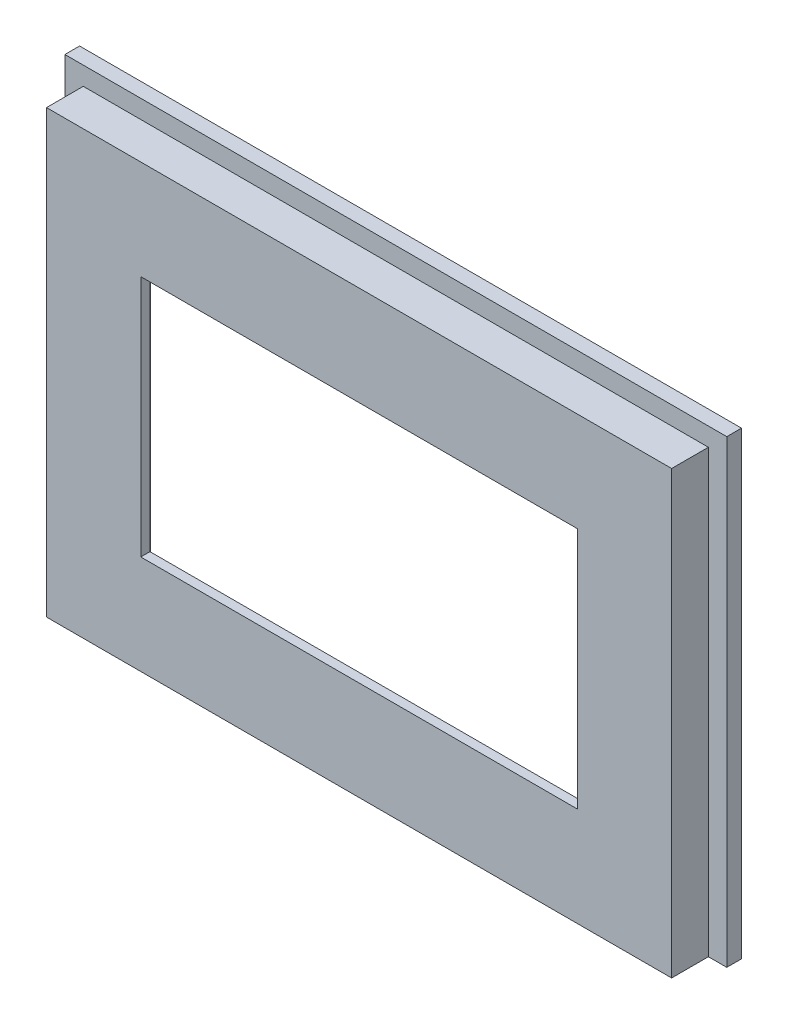
ISO-10303-21;
HEADER;
FILE_DESCRIPTION(('STEP AP214'),'2;1');
FILE_NAME('part.step','',(''),(''),'','','');
FILE_SCHEMA(('AUTOMOTIVE_DESIGN { 1 0 10303 214 1 1 1 1 }'));
ENDSEC;
DATA;
#1=APPLICATION_CONTEXT('core data for automotive mechanical design processes');
#2=APPLICATION_PROTOCOL_DEFINITION('international standard','automotive_design',2000,#1);
#3=PRODUCT_CONTEXT('',#1,'mechanical');
#4=PRODUCT('Part','Part','',(#3));
#5=PRODUCT_RELATED_PRODUCT_CATEGORY('part','',(#4));
#6=PRODUCT_DEFINITION_FORMATION('','',#4);
#7=PRODUCT_DEFINITION_CONTEXT('part definition',#1,'design');
#8=PRODUCT_DEFINITION('design','',#6,#7);
#9=PRODUCT_DEFINITION_SHAPE('','',#8);
#10=(LENGTH_UNIT() NAMED_UNIT(*) SI_UNIT(.MILLI.,.METRE.));
#11=(NAMED_UNIT(*) PLANE_ANGLE_UNIT() SI_UNIT($,.RADIAN.));
#12=(NAMED_UNIT(*) SI_UNIT($,.STERADIAN.) SOLID_ANGLE_UNIT());
#13=UNCERTAINTY_MEASURE_WITH_UNIT(LENGTH_MEASURE(1.E-05),#10,'distance_accuracy_value','');
#14=(GEOMETRIC_REPRESENTATION_CONTEXT(3) GLOBAL_UNCERTAINTY_ASSIGNED_CONTEXT((#13)) GLOBAL_UNIT_ASSIGNED_CONTEXT((#10,
#11,#12)) REPRESENTATION_CONTEXT('',''));
#15=CARTESIAN_POINT('',(0.,0.,0.));
#16=DIRECTION('',(0.,0.,1.));
#17=DIRECTION('',(1.,0.,0.));
#18=AXIS2_PLACEMENT_3D('',#15,#16,#17);
#19=CARTESIAN_POINT('',(0.,0.,0.));
#20=DIRECTION('',(0.,0.,1.));
#21=DIRECTION('',(1.,0.,0.));
#22=AXIS2_PLACEMENT_3D('',#19,#20,#21);
#23=PLANE('',#22);
#24=DIRECTION('',(0.,1.,0.));
#25=VECTOR('',#24,1.);
#26=CARTESIAN_POINT('',(-1.,0.,0.));
#27=LINE('',#26,#25);
#28=CARTESIAN_POINT('',(-1.,0.,0.));
#29=VERTEX_POINT('',#28);
#30=CARTESIAN_POINT('',(-1.,23.,0.));
#31=VERTEX_POINT('',#30);
#32=EDGE_CURVE('E192',#29,#31,#27,.T.);
#33=ORIENTED_EDGE('',*,*,#32,.F.);
#34=DIRECTION('',(1.,0.,0.));
#35=VECTOR('',#34,1.);
#36=CARTESIAN_POINT('',(0.,0.,0.));
#37=LINE('',#36,#35);
#38=CARTESIAN_POINT('',(-3.652,0.,0.));
#39=VERTEX_POINT('',#38);
#40=EDGE_CURVE('E291',#39,#29,#37,.T.);
#41=ORIENTED_EDGE('',*,*,#40,.F.);
#42=DIRECTION('',(0.,-1.,0.));
#43=VECTOR('',#42,1.);
#44=CARTESIAN_POINT('',(-3.652,19.748,0.));
#45=LINE('',#44,#43);
#46=CARTESIAN_POINT('',(-3.652,19.748,0.));
#47=VERTEX_POINT('',#46);
#48=EDGE_CURVE('E193',#47,#39,#45,.T.);
#49=ORIENTED_EDGE('',*,*,#48,.F.);
#50=DIRECTION('',(1.,0.,0.));
#51=VECTOR('',#50,1.);
#52=CARTESIAN_POINT('',(-3.652,19.748,0.));
#53=LINE('',#52,#51);
#54=CARTESIAN_POINT('',(-30.352,19.748,0.));
#55=VERTEX_POINT('',#54);
#56=EDGE_CURVE('E404',#55,#47,#53,.T.);
#57=ORIENTED_EDGE('',*,*,#56,.F.);
#58=DIRECTION('',(0.,1.,0.));
#59=VECTOR('',#58,1.);
#60=CARTESIAN_POINT('',(-30.352,19.748,0.));
#61=LINE('',#60,#59);
#62=CARTESIAN_POINT('',(-30.352,0.,0.));
#63=VERTEX_POINT('',#62);
#64=EDGE_CURVE('E195',#63,#55,#61,.T.);
#65=ORIENTED_EDGE('',*,*,#64,.F.);
#66=CARTESIAN_POINT('',(-33.,0.,0.));
#67=VERTEX_POINT('',#66);
#68=EDGE_CURVE('E55',#67,#63,#37,.T.);
#69=ORIENTED_EDGE('',*,*,#68,.F.);
#70=DIRECTION('',(0.,-1.,0.));
#71=VECTOR('',#70,1.);
#72=CARTESIAN_POINT('',(-33.,23.,0.));
#73=LINE('',#72,#71);
#74=CARTESIAN_POINT('',(-33.,23.,0.));
#75=VERTEX_POINT('',#74);
#76=EDGE_CURVE('E232',#75,#67,#73,.T.);
#77=ORIENTED_EDGE('',*,*,#76,.F.);
#78=DIRECTION('',(-1.,0.,0.));
#79=VECTOR('',#78,1.);
#80=CARTESIAN_POINT('',(-1.,23.,0.));
#81=LINE('',#80,#79);
#82=EDGE_CURVE('E49',#31,#75,#81,.T.);
#83=ORIENTED_EDGE('',*,*,#82,.F.);
#84=EDGE_LOOP('',(#33,#41,#49,#57,#65,#69,#77,#83));
#85=FACE_BOUND('',#84,.T.);
#86=ADVANCED_FACE('F32',(#85),#23,.F.);
#87=CARTESIAN_POINT('',(-28.874,18.6,2.));
#88=DIRECTION('',(1.,0.,0.));
#89=DIRECTION('',(0.,0.,-1.));
#90=AXIS2_PLACEMENT_3D('',#87,#88,#89);
#91=PLANE('',#90);
#92=DIRECTION('',(0.,0.,-1.));
#93=VECTOR('',#92,1.);
#94=CARTESIAN_POINT('',(-28.874,5.396,2.));
#95=LINE('',#94,#93);
#96=CARTESIAN_POINT('',(-28.874,5.396,2.));
#97=VERTEX_POINT('',#96);
#98=CARTESIAN_POINT('',(-28.874,5.396,1.5));
#99=VERTEX_POINT('',#98);
#100=EDGE_CURVE('E265',#97,#99,#95,.T.);
#101=ORIENTED_EDGE('',*,*,#100,.T.);
#102=DIRECTION('',(0.,1.,0.));
#103=VECTOR('',#102,1.);
#104=CARTESIAN_POINT('',(-28.874,18.6,1.5));
#105=LINE('',#104,#103);
#106=CARTESIAN_POINT('',(-28.874,18.6,1.5));
#107=VERTEX_POINT('',#106);
#108=EDGE_CURVE('E389',#99,#107,#105,.T.);
#109=ORIENTED_EDGE('',*,*,#108,.T.);
#110=DIRECTION('',(0.,0.,-1.));
#111=VECTOR('',#110,1.);
#112=CARTESIAN_POINT('',(-28.874,18.6,2.));
#113=LINE('',#112,#111);
#114=CARTESIAN_POINT('',(-28.874,18.6,2.));
#115=VERTEX_POINT('',#114);
#116=EDGE_CURVE('E375',#115,#107,#113,.T.);
#117=ORIENTED_EDGE('',*,*,#116,.F.);
#118=DIRECTION('',(0.,-1.,0.));
#119=VECTOR('',#118,1.);
#120=CARTESIAN_POINT('',(-28.874,18.6,2.));
#121=LINE('',#120,#119);
#122=EDGE_CURVE('E385',#115,#97,#121,.T.);
#123=ORIENTED_EDGE('',*,*,#122,.T.);
#124=EDGE_LOOP('',(#101,#109,#117,#123));
#125=FACE_BOUND('',#124,.T.);
#126=ADVANCED_FACE('F342',(#125),#91,.T.);
#127=CARTESIAN_POINT('',(-28.874,5.396,2.));
#128=DIRECTION('',(0.,1.,0.));
#129=DIRECTION('',(0.,0.,1.));
#130=AXIS2_PLACEMENT_3D('',#127,#128,#129);
#131=PLANE('',#130);
#132=DIRECTION('',(0.,0.,-1.));
#133=VECTOR('',#132,1.);
#134=CARTESIAN_POINT('',(-5.13,5.396,2.));
#135=LINE('',#134,#133);
#136=CARTESIAN_POINT('',(-5.13,5.396,2.));
#137=VERTEX_POINT('',#136);
#138=CARTESIAN_POINT('',(-5.13,5.396,1.5));
#139=VERTEX_POINT('',#138);
#140=EDGE_CURVE('E270',#137,#139,#135,.T.);
#141=ORIENTED_EDGE('',*,*,#140,.T.);
#142=DIRECTION('',(-1.,0.,0.));
#143=VECTOR('',#142,1.);
#144=CARTESIAN_POINT('',(-28.874,5.396,1.5));
#145=LINE('',#144,#143);
#146=EDGE_CURVE('E392',#139,#99,#145,.T.);
#147=ORIENTED_EDGE('',*,*,#146,.T.);
#148=ORIENTED_EDGE('',*,*,#100,.F.);
#149=DIRECTION('',(1.,0.,0.));
#150=VECTOR('',#149,1.);
#151=CARTESIAN_POINT('',(-28.874,5.396,2.));
#152=LINE('',#151,#150);
#153=EDGE_CURVE('E383',#97,#137,#152,.T.);
#154=ORIENTED_EDGE('',*,*,#153,.T.);
#155=EDGE_LOOP('',(#141,#147,#148,#154));
#156=FACE_BOUND('',#155,.T.);
#157=ADVANCED_FACE('F347',(#156),#131,.T.);
#158=CARTESIAN_POINT('',(-5.13,18.6,2.));
#159=DIRECTION('',(-1.,0.,0.));
#160=DIRECTION('',(0.,-1.,0.));
#161=AXIS2_PLACEMENT_3D('',#158,#159,#160);
#162=PLANE('',#161);
#163=DIRECTION('',(0.,0.,-1.));
#164=VECTOR('',#163,1.);
#165=CARTESIAN_POINT('',(-5.13,18.6,2.));
#166=LINE('',#165,#164);
#167=CARTESIAN_POINT('',(-5.13,18.6,2.));
#168=VERTEX_POINT('',#167);
#169=CARTESIAN_POINT('',(-5.13,18.6,1.5));
#170=VERTEX_POINT('',#169);
#171=EDGE_CURVE('E372',#168,#170,#166,.T.);
#172=ORIENTED_EDGE('',*,*,#171,.T.);
#173=DIRECTION('',(0.,-1.,0.));
#174=VECTOR('',#173,1.);
#175=CARTESIAN_POINT('',(-5.13,18.6,1.5));
#176=LINE('',#175,#174);
#177=EDGE_CURVE('E395',#170,#139,#176,.T.);
#178=ORIENTED_EDGE('',*,*,#177,.T.);
#179=ORIENTED_EDGE('',*,*,#140,.F.);
#180=DIRECTION('',(0.,1.,0.));
#181=VECTOR('',#180,1.);
#182=CARTESIAN_POINT('',(-5.13,18.6,2.));
#183=LINE('',#182,#181);
#184=EDGE_CURVE('E380',#137,#168,#183,.T.);
#185=ORIENTED_EDGE('',*,*,#184,.T.);
#186=EDGE_LOOP('',(#172,#178,#179,#185));
#187=FACE_BOUND('',#186,.T.);
#188=ADVANCED_FACE('F446',(#187),#162,.T.);
#189=CARTESIAN_POINT('',(-28.874,18.6,2.));
#190=DIRECTION('',(0.,-1.,0.));
#191=DIRECTION('',(0.,0.,-1.));
#192=AXIS2_PLACEMENT_3D('',#189,#190,#191);
#193=PLANE('',#192);
#194=ORIENTED_EDGE('',*,*,#116,.T.);
#195=DIRECTION('',(1.,0.,0.));
#196=VECTOR('',#195,1.);
#197=CARTESIAN_POINT('',(-28.874,18.6,1.5));
#198=LINE('',#197,#196);
#199=EDGE_CURVE('E296',#107,#170,#198,.T.);
#200=ORIENTED_EDGE('',*,*,#199,.T.);
#201=ORIENTED_EDGE('',*,*,#171,.F.);
#202=DIRECTION('',(-1.,0.,0.));
#203=VECTOR('',#202,1.);
#204=CARTESIAN_POINT('',(-28.874,18.6,2.));
#205=LINE('',#204,#203);
#206=EDGE_CURVE('E378',#168,#115,#205,.T.);
#207=ORIENTED_EDGE('',*,*,#206,.T.);
#208=EDGE_LOOP('',(#194,#200,#201,#207));
#209=FACE_BOUND('',#208,.T.);
#210=ADVANCED_FACE('F443',(#209),#193,.T.);
#211=CARTESIAN_POINT('',(0.,0.,2.));
#212=DIRECTION('',(0.,0.,1.));
#213=DIRECTION('',(1.,0.,0.));
#214=AXIS2_PLACEMENT_3D('',#211,#212,#213);
#215=PLANE('',#214);
#216=DIRECTION('',(0.,1.,0.));
#217=VECTOR('',#216,1.);
#218=CARTESIAN_POINT('',(0.,0.,2.));
#219=LINE('',#218,#217);
#220=CARTESIAN_POINT('',(0.,0.,2.));
#221=VERTEX_POINT('',#220);
#222=CARTESIAN_POINT('',(0.,24.,2.));
#223=VERTEX_POINT('',#222);
#224=EDGE_CURVE('E366',#221,#223,#219,.T.);
#225=ORIENTED_EDGE('',*,*,#224,.T.);
#226=DIRECTION('',(-1.,0.,0.));
#227=VECTOR('',#226,1.);
#228=CARTESIAN_POINT('',(0.,24.,2.));
#229=LINE('',#228,#227);
#230=CARTESIAN_POINT('',(-34.,24.,2.));
#231=VERTEX_POINT('',#230);
#232=EDGE_CURVE('E363',#223,#231,#229,.T.);
#233=ORIENTED_EDGE('',*,*,#232,.T.);
#234=DIRECTION('',(0.,-1.,0.));
#235=VECTOR('',#234,1.);
#236=CARTESIAN_POINT('',(-34.,0.,2.));
#237=LINE('',#236,#235);
#238=CARTESIAN_POINT('',(-34.,0.,2.));
#239=VERTEX_POINT('',#238);
#240=EDGE_CURVE('E312',#231,#239,#237,.T.);
#241=ORIENTED_EDGE('',*,*,#240,.T.);
#242=DIRECTION('',(1.,0.,0.));
#243=VECTOR('',#242,1.);
#244=CARTESIAN_POINT('',(0.,0.,2.));
#245=LINE('',#244,#243);
#246=EDGE_CURVE('E280',#239,#221,#245,.T.);
#247=ORIENTED_EDGE('',*,*,#246,.T.);
#248=EDGE_LOOP('',(#225,#233,#241,#247));
#249=FACE_BOUND('',#248,.T.);
#250=ORIENTED_EDGE('',*,*,#153,.F.);
#251=ORIENTED_EDGE('',*,*,#122,.F.);
#252=ORIENTED_EDGE('',*,*,#206,.F.);
#253=ORIENTED_EDGE('',*,*,#184,.F.);
#254=EDGE_LOOP('',(#250,#251,#252,#253));
#255=FACE_BOUND('',#254,.T.);
#256=ADVANCED_FACE('F352',(#249,#255),#215,.T.);
#257=CARTESIAN_POINT('',(0.,0.,2.));
#258=DIRECTION('',(-1.,0.,0.));
#259=DIRECTION('',(0.,-1.,0.));
#260=AXIS2_PLACEMENT_3D('',#257,#258,#259);
#261=PLANE('',#260);
#262=DIRECTION('',(0.,1.,0.));
#263=VECTOR('',#262,1.);
#264=CARTESIAN_POINT('',(0.,0.,0.));
#265=LINE('',#264,#263);
#266=CARTESIAN_POINT('',(0.,0.,0.));
#267=VERTEX_POINT('',#266);
#268=CARTESIAN_POINT('',(0.,24.,0.));
#269=VERTEX_POINT('',#268);
#270=EDGE_CURVE('E261',#267,#269,#265,.T.);
#271=ORIENTED_EDGE('',*,*,#270,.T.);
#272=DIRECTION('',(0.,0.,-1.));
#273=VECTOR('',#272,1.);
#274=CARTESIAN_POINT('',(0.,24.,2.));
#275=LINE('',#274,#273);
#276=EDGE_CURVE('E298',#223,#269,#275,.T.);
#277=ORIENTED_EDGE('',*,*,#276,.F.);
#278=ORIENTED_EDGE('',*,*,#224,.F.);
#279=DIRECTION('',(0.,0.,-1.));
#280=VECTOR('',#279,1.);
#281=CARTESIAN_POINT('',(0.,0.,2.));
#282=LINE('',#281,#280);
#283=EDGE_CURVE('E306',#221,#267,#282,.T.);
#284=ORIENTED_EDGE('',*,*,#283,.T.);
#285=EDGE_LOOP('',(#271,#277,#278,#284));
#286=FACE_BOUND('',#285,.T.);
#287=ADVANCED_FACE('F34',(#286),#261,.F.);
#288=CARTESIAN_POINT('',(0.,24.,2.));
#289=DIRECTION('',(0.,-1.,0.));
#290=DIRECTION('',(1.,0.,0.));
#291=AXIS2_PLACEMENT_3D('',#288,#289,#290);
#292=PLANE('',#291);
#293=DIRECTION('',(-1.,0.,0.));
#294=VECTOR('',#293,1.);
#295=CARTESIAN_POINT('',(0.,24.,0.));
#296=LINE('',#295,#294);
#297=CARTESIAN_POINT('',(-34.,24.,0.));
#298=VERTEX_POINT('',#297);
#299=EDGE_CURVE('E262',#269,#298,#296,.T.);
#300=ORIENTED_EDGE('',*,*,#299,.T.);
#301=DIRECTION('',(0.,0.,-1.));
#302=VECTOR('',#301,1.);
#303=CARTESIAN_POINT('',(-34.,24.,2.));
#304=LINE('',#303,#302);
#305=EDGE_CURVE('E285',#231,#298,#304,.T.);
#306=ORIENTED_EDGE('',*,*,#305,.F.);
#307=ORIENTED_EDGE('',*,*,#232,.F.);
#308=ORIENTED_EDGE('',*,*,#276,.T.);
#309=EDGE_LOOP('',(#300,#306,#307,#308));
#310=FACE_BOUND('',#309,.T.);
#311=ADVANCED_FACE('F358',(#310),#292,.F.);
#312=CARTESIAN_POINT('',(-34.,0.,2.));
#313=DIRECTION('',(1.,0.,0.));
#314=DIRECTION('',(0.,0.,-1.));
#315=AXIS2_PLACEMENT_3D('',#312,#313,#314);
#316=PLANE('',#315);
#317=DIRECTION('',(0.,-1.,0.));
#318=VECTOR('',#317,1.);
#319=CARTESIAN_POINT('',(-34.,0.,0.));
#320=LINE('',#319,#318);
#321=CARTESIAN_POINT('',(-34.,0.,0.));
#322=VERTEX_POINT('',#321);
#323=EDGE_CURVE('E267',#298,#322,#320,.T.);
#324=ORIENTED_EDGE('',*,*,#323,.T.);
#325=DIRECTION('',(0.,0.,-1.));
#326=VECTOR('',#325,1.);
#327=CARTESIAN_POINT('',(-34.,0.,2.));
#328=LINE('',#327,#326);
#329=EDGE_CURVE('E301',#239,#322,#328,.T.);
#330=ORIENTED_EDGE('',*,*,#329,.F.);
#331=ORIENTED_EDGE('',*,*,#240,.F.);
#332=ORIENTED_EDGE('',*,*,#305,.T.);
#333=EDGE_LOOP('',(#324,#330,#331,#332));
#334=FACE_BOUND('',#333,.T.);
#335=ADVANCED_FACE('F356',(#334),#316,.F.);
#336=CARTESIAN_POINT('',(0.,0.,2.));
#337=DIRECTION('',(0.,1.,0.));
#338=DIRECTION('',(0.,0.,1.));
#339=AXIS2_PLACEMENT_3D('',#336,#337,#338);
#340=PLANE('',#339);
#341=DIRECTION('',(-1.,0.,0.));
#342=VECTOR('',#341,1.);
#343=CARTESIAN_POINT('',(0.,0.,1.5));
#344=LINE('',#343,#342);
#345=CARTESIAN_POINT('',(-3.652,0.,1.5));
#346=VERTEX_POINT('',#345);
#347=CARTESIAN_POINT('',(-30.352,0.,1.5));
#348=VERTEX_POINT('',#347);
#349=EDGE_CURVE('E387',#346,#348,#344,.T.);
#350=ORIENTED_EDGE('',*,*,#349,.F.);
#351=DIRECTION('',(0.,0.,-1.));
#352=VECTOR('',#351,1.);
#353=CARTESIAN_POINT('',(-3.652,0.,2.));
#354=LINE('',#353,#352);
#355=EDGE_CURVE('E11',#346,#39,#354,.T.);
#356=ORIENTED_EDGE('',*,*,#355,.T.);
#357=ORIENTED_EDGE('',*,*,#40,.T.);
#358=DIRECTION('',(0.,0.,1.));
#359=VECTOR('',#358,1.);
#360=CARTESIAN_POINT('',(-1.,0.,-0.8));
#361=LINE('',#360,#359);
#362=CARTESIAN_POINT('',(-1.,0.,-0.8));
#363=VERTEX_POINT('',#362);
#364=EDGE_CURVE('E216',#363,#29,#361,.T.);
#365=ORIENTED_EDGE('',*,*,#364,.F.);
#366=DIRECTION('',(-1.,0.,0.));
#367=VECTOR('',#366,1.);
#368=CARTESIAN_POINT('',(-1.,0.,-0.8));
#369=LINE('',#368,#367);
#370=CARTESIAN_POINT('',(1.,0.,-0.8));
#371=VERTEX_POINT('',#370);
#372=EDGE_CURVE('E185',#371,#363,#369,.T.);
#373=ORIENTED_EDGE('',*,*,#372,.F.);
#374=DIRECTION('',(0.,0.,1.));
#375=VECTOR('',#374,1.);
#376=CARTESIAN_POINT('',(1.,0.,-0.8));
#377=LINE('',#376,#375);
#378=CARTESIAN_POINT('',(1.,0.,0.));
#379=VERTEX_POINT('',#378);
#380=EDGE_CURVE('E212',#371,#379,#377,.T.);
#381=ORIENTED_EDGE('',*,*,#380,.T.);
#382=DIRECTION('',(-1.,0.,0.));
#383=VECTOR('',#382,1.);
#384=CARTESIAN_POINT('',(-1.,0.,0.));
#385=LINE('',#384,#383);
#386=EDGE_CURVE('E189',#379,#267,#385,.T.);
#387=ORIENTED_EDGE('',*,*,#386,.T.);
#388=ORIENTED_EDGE('',*,*,#283,.F.);
#389=ORIENTED_EDGE('',*,*,#246,.F.);
#390=ORIENTED_EDGE('',*,*,#329,.T.);
#391=DIRECTION('',(-1.,0.,0.));
#392=VECTOR('',#391,1.);
#393=CARTESIAN_POINT('',(-35.,0.,0.));
#394=LINE('',#393,#392);
#395=CARTESIAN_POINT('',(-35.,0.,0.));
#396=VERTEX_POINT('',#395);
#397=EDGE_CURVE('E205',#322,#396,#394,.T.);
#398=ORIENTED_EDGE('',*,*,#397,.T.);
#399=DIRECTION('',(0.,0.,1.));
#400=VECTOR('',#399,1.);
#401=CARTESIAN_POINT('',(-35.,0.,-0.8));
#402=LINE('',#401,#400);
#403=CARTESIAN_POINT('',(-35.,0.,-0.8));
#404=VERTEX_POINT('',#403);
#405=EDGE_CURVE('E221',#404,#396,#402,.T.);
#406=ORIENTED_EDGE('',*,*,#405,.F.);
#407=DIRECTION('',(-1.,0.,0.));
#408=VECTOR('',#407,1.);
#409=CARTESIAN_POINT('',(-35.,0.,-0.8));
#410=LINE('',#409,#408);
#411=CARTESIAN_POINT('',(-33.,0.,-0.8));
#412=VERTEX_POINT('',#411);
#413=EDGE_CURVE('E320',#412,#404,#410,.T.);
#414=ORIENTED_EDGE('',*,*,#413,.F.);
#415=DIRECTION('',(0.,0.,1.));
#416=VECTOR('',#415,1.);
#417=CARTESIAN_POINT('',(-33.,0.,-0.8));
#418=LINE('',#417,#416);
#419=EDGE_CURVE('E197',#412,#67,#418,.T.);
#420=ORIENTED_EDGE('',*,*,#419,.T.);
#421=ORIENTED_EDGE('',*,*,#68,.T.);
#422=DIRECTION('',(0.,0.,1.));
#423=VECTOR('',#422,1.);
#424=CARTESIAN_POINT('',(-30.352,0.,2.));
#425=LINE('',#424,#423);
#426=EDGE_CURVE('E41',#63,#348,#425,.T.);
#427=ORIENTED_EDGE('',*,*,#426,.T.);
#428=EDGE_LOOP('',(#350,#356,#357,#365,#373,#381,#387,#388,#389,#390,#398,#406,#414,#420,#421,#427));
#429=FACE_BOUND('',#428,.T.);
#430=ADVANCED_FACE('F254',(#429),#340,.F.);
#431=CARTESIAN_POINT('',(-3.652,19.748,1.5));
#432=DIRECTION('',(1.,0.,0.));
#433=DIRECTION('',(0.,1.,0.));
#434=AXIS2_PLACEMENT_3D('',#431,#432,#433);
#435=PLANE('',#434);
#436=DIRECTION('',(0.,-1.,0.));
#437=VECTOR('',#436,1.);
#438=CARTESIAN_POINT('',(-3.652,19.748,1.5));
#439=LINE('',#438,#437);
#440=CARTESIAN_POINT('',(-3.652,19.748,1.5));
#441=VERTEX_POINT('',#440);
#442=EDGE_CURVE('E407',#441,#346,#439,.T.);
#443=ORIENTED_EDGE('',*,*,#442,.F.);
#444=DIRECTION('',(0.,0.,-1.));
#445=VECTOR('',#444,1.);
#446=CARTESIAN_POINT('',(-3.652,19.748,1.5));
#447=LINE('',#446,#445);
#448=EDGE_CURVE('E398',#441,#47,#447,.T.);
#449=ORIENTED_EDGE('',*,*,#448,.T.);
#450=ORIENTED_EDGE('',*,*,#48,.T.);
#451=ORIENTED_EDGE('',*,*,#355,.F.);
#452=EDGE_LOOP('',(#443,#449,#450,#451));
#453=FACE_BOUND('',#452,.T.);
#454=ADVANCED_FACE('F355',(#453),#435,.F.);
#455=CARTESIAN_POINT('',(-30.352,19.748,1.5));
#456=DIRECTION('',(-1.,0.,0.));
#457=DIRECTION('',(0.,-1.,0.));
#458=AXIS2_PLACEMENT_3D('',#455,#456,#457);
#459=PLANE('',#458);
#460=ORIENTED_EDGE('',*,*,#64,.T.);
#461=DIRECTION('',(0.,0.,-1.));
#462=VECTOR('',#461,1.);
#463=CARTESIAN_POINT('',(-30.352,19.748,1.5));
#464=LINE('',#463,#462);
#465=CARTESIAN_POINT('',(-30.352,19.748,1.5));
#466=VERTEX_POINT('',#465);
#467=EDGE_CURVE('E399',#466,#55,#464,.T.);
#468=ORIENTED_EDGE('',*,*,#467,.F.);
#469=DIRECTION('',(0.,1.,0.));
#470=VECTOR('',#469,1.);
#471=CARTESIAN_POINT('',(-30.352,19.748,1.5));
#472=LINE('',#471,#470);
#473=EDGE_CURVE('E411',#348,#466,#472,.T.);
#474=ORIENTED_EDGE('',*,*,#473,.F.);
#475=ORIENTED_EDGE('',*,*,#426,.F.);
#476=EDGE_LOOP('',(#460,#468,#474,#475));
#477=FACE_BOUND('',#476,.T.);
#478=ADVANCED_FACE('F423',(#477),#459,.F.);
#479=CARTESIAN_POINT('',(0.,0.,1.5));
#480=DIRECTION('',(0.,0.,-1.));
#481=DIRECTION('',(-1.,0.,0.));
#482=AXIS2_PLACEMENT_3D('',#479,#480,#481);
#483=PLANE('',#482);
#484=ORIENTED_EDGE('',*,*,#146,.F.);
#485=ORIENTED_EDGE('',*,*,#177,.F.);
#486=ORIENTED_EDGE('',*,*,#199,.F.);
#487=ORIENTED_EDGE('',*,*,#108,.F.);
#488=EDGE_LOOP('',(#484,#485,#486,#487));
#489=FACE_BOUND('',#488,.T.);
#490=ORIENTED_EDGE('',*,*,#349,.T.);
#491=ORIENTED_EDGE('',*,*,#473,.T.);
#492=DIRECTION('',(1.,0.,0.));
#493=VECTOR('',#492,1.);
#494=CARTESIAN_POINT('',(-3.652,19.748,1.5));
#495=LINE('',#494,#493);
#496=EDGE_CURVE('E402',#466,#441,#495,.T.);
#497=ORIENTED_EDGE('',*,*,#496,.T.);
#498=ORIENTED_EDGE('',*,*,#442,.T.);
#499=EDGE_LOOP('',(#490,#491,#497,#498));
#500=FACE_BOUND('',#499,.T.);
#501=ADVANCED_FACE('F415',(#489,#500),#483,.T.);
#502=CARTESIAN_POINT('',(-3.652,19.748,1.5));
#503=DIRECTION('',(0.,1.,0.));
#504=DIRECTION('',(0.,0.,1.));
#505=AXIS2_PLACEMENT_3D('',#502,#503,#504);
#506=PLANE('',#505);
#507=ORIENTED_EDGE('',*,*,#56,.T.);
#508=ORIENTED_EDGE('',*,*,#448,.F.);
#509=ORIENTED_EDGE('',*,*,#496,.F.);
#510=ORIENTED_EDGE('',*,*,#467,.T.);
#511=EDGE_LOOP('',(#507,#508,#509,#510));
#512=FACE_BOUND('',#511,.T.);
#513=ADVANCED_FACE('F427',(#512),#506,.F.);
#514=CARTESIAN_POINT('',(0.,0.,0.));
#515=DIRECTION('',(0.,0.,1.));
#516=DIRECTION('',(1.,0.,0.));
#517=AXIS2_PLACEMENT_3D('',#514,#515,#516);
#518=PLANE('',#517);
#519=ORIENTED_EDGE('',*,*,#323,.F.);
#520=ORIENTED_EDGE('',*,*,#299,.F.);
#521=ORIENTED_EDGE('',*,*,#270,.F.);
#522=ORIENTED_EDGE('',*,*,#386,.F.);
#523=DIRECTION('',(0.,-1.,0.));
#524=VECTOR('',#523,1.);
#525=CARTESIAN_POINT('',(1.,0.,0.));
#526=LINE('',#525,#524);
#527=CARTESIAN_POINT('',(1.,25.,0.));
#528=VERTEX_POINT('',#527);
#529=EDGE_CURVE('E204',#528,#379,#526,.T.);
#530=ORIENTED_EDGE('',*,*,#529,.F.);
#531=DIRECTION('',(1.,0.,0.));
#532=VECTOR('',#531,1.);
#533=CARTESIAN_POINT('',(-0.739142899071929,25.,0.));
#534=LINE('',#533,#532);
#535=CARTESIAN_POINT('',(-35.,25.,0.));
#536=VERTEX_POINT('',#535);
#537=EDGE_CURVE('E243',#536,#528,#534,.T.);
#538=ORIENTED_EDGE('',*,*,#537,.F.);
#539=DIRECTION('',(0.,1.,0.));
#540=VECTOR('',#539,1.);
#541=CARTESIAN_POINT('',(-35.,25.,0.));
#542=LINE('',#541,#540);
#543=EDGE_CURVE('E242',#396,#536,#542,.T.);
#544=ORIENTED_EDGE('',*,*,#543,.F.);
#545=ORIENTED_EDGE('',*,*,#397,.F.);
#546=EDGE_LOOP('',(#519,#520,#521,#522,#530,#538,#544,#545));
#547=FACE_BOUND('',#546,.T.);
#548=ADVANCED_FACE('F258',(#547),#518,.T.);
#549=CARTESIAN_POINT('',(-1.,0.,-0.8));
#550=DIRECTION('',(1.,0.,0.));
#551=DIRECTION('',(0.,0.,-1.));
#552=AXIS2_PLACEMENT_3D('',#549,#550,#551);
#553=PLANE('',#552);
#554=ORIENTED_EDGE('',*,*,#32,.T.);
#555=DIRECTION('',(0.,0.,1.));
#556=VECTOR('',#555,1.);
#557=CARTESIAN_POINT('',(-1.,23.,-0.8));
#558=LINE('',#557,#556);
#559=CARTESIAN_POINT('',(-1.,23.,-0.8));
#560=VERTEX_POINT('',#559);
#561=EDGE_CURVE('E173',#560,#31,#558,.T.);
#562=ORIENTED_EDGE('',*,*,#561,.F.);
#563=DIRECTION('',(0.,1.,0.));
#564=VECTOR('',#563,1.);
#565=CARTESIAN_POINT('',(-1.,0.,-0.8));
#566=LINE('',#565,#564);
#567=EDGE_CURVE('E180',#363,#560,#566,.T.);
#568=ORIENTED_EDGE('',*,*,#567,.F.);
#569=ORIENTED_EDGE('',*,*,#364,.T.);
#570=EDGE_LOOP('',(#554,#562,#568,#569));
#571=FACE_BOUND('',#570,.T.);
#572=ADVANCED_FACE('F191',(#571),#553,.F.);
#573=CARTESIAN_POINT('',(-1.,23.,-0.8));
#574=DIRECTION('',(0.,1.,0.));
#575=DIRECTION('',(0.,0.,1.));
#576=AXIS2_PLACEMENT_3D('',#573,#574,#575);
#577=PLANE('',#576);
#578=ORIENTED_EDGE('',*,*,#82,.T.);
#579=DIRECTION('',(0.,0.,1.));
#580=VECTOR('',#579,1.);
#581=CARTESIAN_POINT('',(-33.,23.,-0.8));
#582=LINE('',#581,#580);
#583=CARTESIAN_POINT('',(-33.,23.,-0.8));
#584=VERTEX_POINT('',#583);
#585=EDGE_CURVE('E176',#584,#75,#582,.T.);
#586=ORIENTED_EDGE('',*,*,#585,.F.);
#587=DIRECTION('',(-1.,0.,0.));
#588=VECTOR('',#587,1.);
#589=CARTESIAN_POINT('',(-1.,23.,-0.8));
#590=LINE('',#589,#588);
#591=EDGE_CURVE('E169',#560,#584,#590,.T.);
#592=ORIENTED_EDGE('',*,*,#591,.F.);
#593=ORIENTED_EDGE('',*,*,#561,.T.);
#594=EDGE_LOOP('',(#578,#586,#592,#593));
#595=FACE_BOUND('',#594,.T.);
#596=ADVANCED_FACE('F171',(#595),#577,.F.);
#597=CARTESIAN_POINT('',(-33.,23.,-0.8));
#598=DIRECTION('',(-1.,0.,0.));
#599=DIRECTION('',(0.,0.,1.));
#600=AXIS2_PLACEMENT_3D('',#597,#598,#599);
#601=PLANE('',#600);
#602=ORIENTED_EDGE('',*,*,#76,.T.);
#603=ORIENTED_EDGE('',*,*,#419,.F.);
#604=DIRECTION('',(0.,-1.,0.));
#605=VECTOR('',#604,1.);
#606=CARTESIAN_POINT('',(-33.,23.,-0.8));
#607=LINE('',#606,#605);
#608=EDGE_CURVE('E179',#584,#412,#607,.T.);
#609=ORIENTED_EDGE('',*,*,#608,.F.);
#610=ORIENTED_EDGE('',*,*,#585,.T.);
#611=EDGE_LOOP('',(#602,#603,#609,#610));
#612=FACE_BOUND('',#611,.T.);
#613=ADVANCED_FACE('F319',(#612),#601,.F.);
#614=CARTESIAN_POINT('',(-35.,25.,-0.8));
#615=DIRECTION('',(1.,0.,0.));
#616=DIRECTION('',(0.,0.,-1.));
#617=AXIS2_PLACEMENT_3D('',#614,#615,#616);
#618=PLANE('',#617);
#619=ORIENTED_EDGE('',*,*,#543,.T.);
#620=DIRECTION('',(0.,0.,1.));
#621=VECTOR('',#620,1.);
#622=CARTESIAN_POINT('',(-35.,25.,-0.8));
#623=LINE('',#622,#621);
#624=CARTESIAN_POINT('',(-35.,25.,-0.8));
#625=VERTEX_POINT('',#624);
#626=EDGE_CURVE('E219',#625,#536,#623,.T.);
#627=ORIENTED_EDGE('',*,*,#626,.F.);
#628=DIRECTION('',(0.,1.,0.));
#629=VECTOR('',#628,1.);
#630=CARTESIAN_POINT('',(-35.,23.0559798583858,-0.8));
#631=LINE('',#630,#629);
#632=EDGE_CURVE('E322',#404,#625,#631,.T.);
#633=ORIENTED_EDGE('',*,*,#632,.F.);
#634=ORIENTED_EDGE('',*,*,#405,.T.);
#635=EDGE_LOOP('',(#619,#627,#633,#634));
#636=FACE_BOUND('',#635,.T.);
#637=ADVANCED_FACE('F333',(#636),#618,.F.);
#638=CARTESIAN_POINT('',(-0.739142899071929,25.,-0.8));
#639=DIRECTION('',(0.,-1.,0.));
#640=DIRECTION('',(0.,0.,-1.));
#641=AXIS2_PLACEMENT_3D('',#638,#639,#640);
#642=PLANE('',#641);
#643=ORIENTED_EDGE('',*,*,#537,.T.);
#644=DIRECTION('',(0.,0.,1.));
#645=VECTOR('',#644,1.);
#646=CARTESIAN_POINT('',(1.,25.,-0.8));
#647=LINE('',#646,#645);
#648=CARTESIAN_POINT('',(1.,25.,-0.8));
#649=VERTEX_POINT('',#648);
#650=EDGE_CURVE('E215',#649,#528,#647,.T.);
#651=ORIENTED_EDGE('',*,*,#650,.F.);
#652=DIRECTION('',(1.,0.,0.));
#653=VECTOR('',#652,1.);
#654=CARTESIAN_POINT('',(-0.739142899071929,25.,-0.8));
#655=LINE('',#654,#653);
#656=EDGE_CURVE('E326',#625,#649,#655,.T.);
#657=ORIENTED_EDGE('',*,*,#656,.F.);
#658=ORIENTED_EDGE('',*,*,#626,.T.);
#659=EDGE_LOOP('',(#643,#651,#657,#658));
#660=FACE_BOUND('',#659,.T.);
#661=ADVANCED_FACE('F331',(#660),#642,.F.);
#662=CARTESIAN_POINT('',(1.,0.,-0.8));
#663=DIRECTION('',(-1.,0.,0.));
#664=DIRECTION('',(0.,0.,1.));
#665=AXIS2_PLACEMENT_3D('',#662,#663,#664);
#666=PLANE('',#665);
#667=ORIENTED_EDGE('',*,*,#529,.T.);
#668=ORIENTED_EDGE('',*,*,#380,.F.);
#669=DIRECTION('',(0.,-1.,0.));
#670=VECTOR('',#669,1.);
#671=CARTESIAN_POINT('',(1.,0.,-0.8));
#672=LINE('',#671,#670);
#673=EDGE_CURVE('E328',#649,#371,#672,.T.);
#674=ORIENTED_EDGE('',*,*,#673,.F.);
#675=ORIENTED_EDGE('',*,*,#650,.T.);
#676=EDGE_LOOP('',(#667,#668,#674,#675));
#677=FACE_BOUND('',#676,.T.);
#678=ADVANCED_FACE('F249',(#677),#666,.F.);
#679=CARTESIAN_POINT('',(0.,0.,-0.8));
#680=DIRECTION('',(0.,0.,1.));
#681=DIRECTION('',(1.,0.,0.));
#682=AXIS2_PLACEMENT_3D('',#679,#680,#681);
#683=PLANE('',#682);
#684=ORIENTED_EDGE('',*,*,#567,.T.);
#685=ORIENTED_EDGE('',*,*,#591,.T.);
#686=ORIENTED_EDGE('',*,*,#608,.T.);
#687=ORIENTED_EDGE('',*,*,#413,.T.);
#688=ORIENTED_EDGE('',*,*,#632,.T.);
#689=ORIENTED_EDGE('',*,*,#656,.T.);
#690=ORIENTED_EDGE('',*,*,#673,.T.);
#691=ORIENTED_EDGE('',*,*,#372,.T.);
#692=EDGE_LOOP('',(#684,#685,#686,#687,#688,#689,#690,#691));
#693=FACE_BOUND('',#692,.T.);
#694=ADVANCED_FACE('F183',(#693),#683,.F.);
#695=CLOSED_SHELL('',(#86,#126,#157,#188,#210,#256,#287,#311,#335,#430,#454,#478,#501,#513,#548,
#572,#596,#613,#637,#661,#678,#694));
#696=MANIFOLD_SOLID_BREP('B2',#695);
#697=ADVANCED_BREP_SHAPE_REPRESENTATION('',(#18,#696),#14);
#698=SHAPE_DEFINITION_REPRESENTATION(#9,#697);
ENDSEC;
END-ISO-10303-21;
